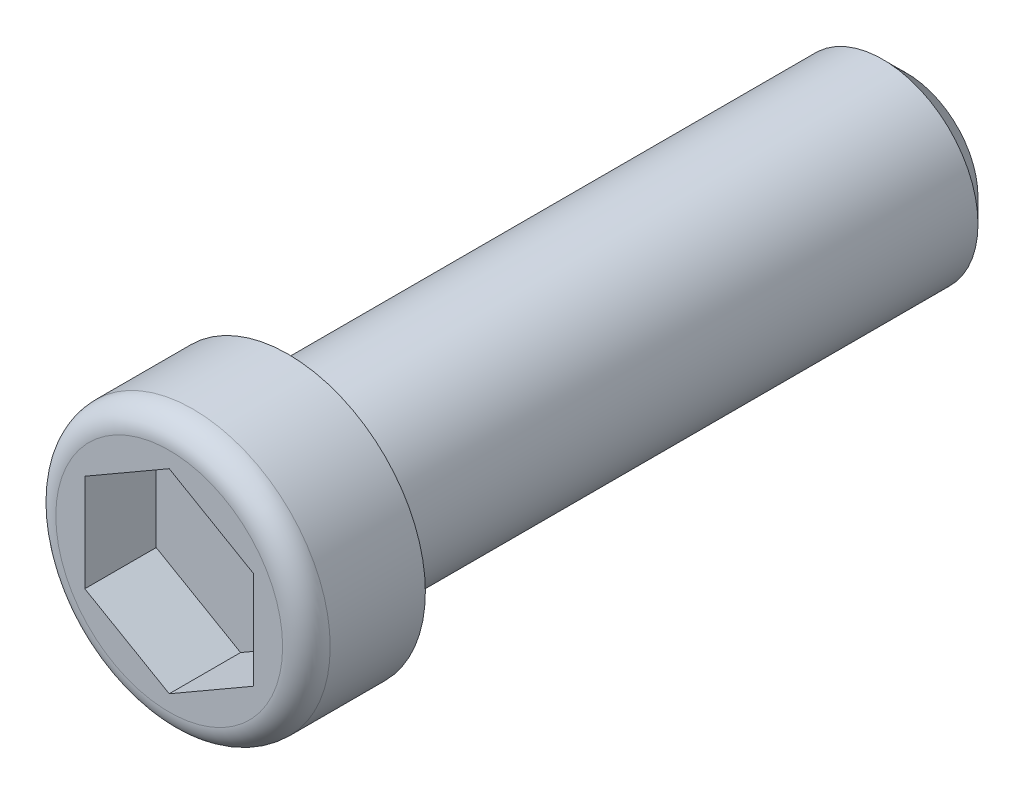
ISO-10303-21;
HEADER;
FILE_DESCRIPTION(('STEP AP214'),'2;1');
FILE_NAME('part.step','',(''),(''),'','','');
FILE_SCHEMA(('AUTOMOTIVE_DESIGN { 1 0 10303 214 1 1 1 1 }'));
ENDSEC;
DATA;
#1=APPLICATION_CONTEXT('core data for automotive mechanical design processes');
#2=APPLICATION_PROTOCOL_DEFINITION('international standard','automotive_design',2000,#1);
#3=PRODUCT_CONTEXT('',#1,'mechanical');
#4=PRODUCT('Part','Part','',(#3));
#5=PRODUCT_RELATED_PRODUCT_CATEGORY('part','',(#4));
#6=PRODUCT_DEFINITION_FORMATION('','',#4);
#7=PRODUCT_DEFINITION_CONTEXT('part definition',#1,'design');
#8=PRODUCT_DEFINITION('design','',#6,#7);
#9=PRODUCT_DEFINITION_SHAPE('','',#8);
#10=(LENGTH_UNIT() NAMED_UNIT(*) SI_UNIT(.MILLI.,.METRE.));
#11=(NAMED_UNIT(*) PLANE_ANGLE_UNIT() SI_UNIT($,.RADIAN.));
#12=(NAMED_UNIT(*) SI_UNIT($,.STERADIAN.) SOLID_ANGLE_UNIT());
#13=UNCERTAINTY_MEASURE_WITH_UNIT(LENGTH_MEASURE(1.E-05),#10,'distance_accuracy_value','');
#14=(GEOMETRIC_REPRESENTATION_CONTEXT(3) GLOBAL_UNCERTAINTY_ASSIGNED_CONTEXT((#13)) GLOBAL_UNIT_ASSIGNED_CONTEXT((#10,
#11,#12)) REPRESENTATION_CONTEXT('',''));
#15=CARTESIAN_POINT('',(0.,0.,0.));
#16=DIRECTION('',(0.,0.,1.));
#17=DIRECTION('',(1.,0.,0.));
#18=AXIS2_PLACEMENT_3D('',#15,#16,#17);
#19=CARTESIAN_POINT('',(0.,0.,13.));
#20=DIRECTION('',(0.,0.,-1.));
#21=DIRECTION('',(-1.,0.,0.));
#22=AXIS2_PLACEMENT_3D('',#19,#20,#21);
#23=CYLINDRICAL_SURFACE('',#22,2.);
#24=CARTESIAN_POINT('',(0.,0.,0.500000000000011));
#25=DIRECTION('',(0.,0.,1.));
#26=DIRECTION('',(1.,0.,0.));
#27=AXIS2_PLACEMENT_3D('',#24,#25,#26);
#28=CIRCLE('',#27,2.);
#29=CARTESIAN_POINT('',(-2.,0.,0.500000000000011));
#30=VERTEX_POINT('',#29);
#31=EDGE_CURVE('E150',#30,#30,#28,.T.);
#32=CARTESIAN_POINT('',(0.,0.,13.));
#33=DIRECTION('',(0.,0.,1.));
#34=DIRECTION('',(1.,0.,0.));
#35=AXIS2_PLACEMENT_3D('',#32,#33,#34);
#36=CIRCLE('',#35,2.);
#37=CARTESIAN_POINT('',(-2.,0.,13.));
#38=VERTEX_POINT('',#37);
#39=EDGE_CURVE('E147',#38,#38,#36,.T.);
#40=CARTESIAN_POINT('',(-2.,0.,0.500000000000011));
#41=CARTESIAN_POINT('',(-2.,0.,0.630208333333344));
#42=CARTESIAN_POINT('',(-2.,0.,0.760416666666678));
#43=CARTESIAN_POINT('',(-2.,0.,1.02083333333334));
#44=CARTESIAN_POINT('',(-2.,0.,1.15104166666668));
#45=CARTESIAN_POINT('',(-2.,0.,1.41145833333334));
#46=CARTESIAN_POINT('',(-2.,0.,1.54166666666668));
#47=CARTESIAN_POINT('',(-2.,0.,1.80208333333334));
#48=CARTESIAN_POINT('',(-2.,0.,1.93229166666668));
#49=CARTESIAN_POINT('',(-2.,0.,2.19270833333334));
#50=CARTESIAN_POINT('',(-2.,0.,2.32291666666668));
#51=CARTESIAN_POINT('',(-2.,0.,2.58333333333334));
#52=CARTESIAN_POINT('',(-2.,0.,2.71354166666668));
#53=CARTESIAN_POINT('',(-2.,0.,2.97395833333334));
#54=CARTESIAN_POINT('',(-2.,0.,3.10416666666668));
#55=CARTESIAN_POINT('',(-2.,0.,3.36458333333334));
#56=CARTESIAN_POINT('',(-2.,0.,3.49479166666667));
#57=CARTESIAN_POINT('',(-2.,0.,3.75520833333334));
#58=CARTESIAN_POINT('',(-2.,0.,3.88541666666667));
#59=CARTESIAN_POINT('',(-2.,0.,4.14583333333334));
#60=CARTESIAN_POINT('',(-2.,0.,4.27604166666667));
#61=CARTESIAN_POINT('',(-2.,0.,4.53645833333334));
#62=CARTESIAN_POINT('',(-2.,0.,4.66666666666667));
#63=CARTESIAN_POINT('',(-2.,0.,4.92708333333334));
#64=CARTESIAN_POINT('',(-2.,0.,5.05729166666667));
#65=CARTESIAN_POINT('',(-2.,0.,5.31770833333334));
#66=CARTESIAN_POINT('',(-2.,0.,5.44791666666667));
#67=CARTESIAN_POINT('',(-2.,0.,5.70833333333334));
#68=CARTESIAN_POINT('',(-2.,0.,5.83854166666667));
#69=CARTESIAN_POINT('',(-2.,0.,6.09895833333334));
#70=CARTESIAN_POINT('',(-2.,0.,6.22916666666667));
#71=CARTESIAN_POINT('',(-2.,0.,6.48958333333334));
#72=CARTESIAN_POINT('',(-2.,0.,6.61979166666667));
#73=CARTESIAN_POINT('',(-2.,0.,6.88020833333334));
#74=CARTESIAN_POINT('',(-2.,0.,7.01041666666667));
#75=CARTESIAN_POINT('',(-2.,0.,7.27083333333334));
#76=CARTESIAN_POINT('',(-2.,0.,7.40104166666667));
#77=CARTESIAN_POINT('',(-2.,0.,7.66145833333334));
#78=CARTESIAN_POINT('',(-2.,0.,7.79166666666667));
#79=CARTESIAN_POINT('',(-2.,0.,8.05208333333334));
#80=CARTESIAN_POINT('',(-2.,0.,8.18229166666667));
#81=CARTESIAN_POINT('',(-2.,0.,8.44270833333334));
#82=CARTESIAN_POINT('',(-2.,0.,8.57291666666667));
#83=CARTESIAN_POINT('',(-2.,0.,8.83333333333334));
#84=CARTESIAN_POINT('',(-2.,0.,8.96354166666667));
#85=CARTESIAN_POINT('',(-2.,0.,9.22395833333333));
#86=CARTESIAN_POINT('',(-2.,0.,9.35416666666667));
#87=CARTESIAN_POINT('',(-2.,0.,9.61458333333333));
#88=CARTESIAN_POINT('',(-2.,0.,9.74479166666667));
#89=CARTESIAN_POINT('',(-2.,0.,10.0052083333333));
#90=CARTESIAN_POINT('',(-2.,0.,10.1354166666667));
#91=CARTESIAN_POINT('',(-2.,0.,10.3958333333333));
#92=CARTESIAN_POINT('',(-2.,0.,10.5260416666667));
#93=CARTESIAN_POINT('',(-2.,0.,10.7864583333333));
#94=CARTESIAN_POINT('',(-2.,0.,10.9166666666667));
#95=CARTESIAN_POINT('',(-2.,0.,11.1770833333333));
#96=CARTESIAN_POINT('',(-2.,0.,11.3072916666667));
#97=CARTESIAN_POINT('',(-2.,0.,11.5677083333333));
#98=CARTESIAN_POINT('',(-2.,0.,11.6979166666667));
#99=CARTESIAN_POINT('',(-2.,0.,11.9583333333333));
#100=CARTESIAN_POINT('',(-2.,0.,12.0885416666667));
#101=CARTESIAN_POINT('',(-2.,0.,12.3489583333333));
#102=CARTESIAN_POINT('',(-2.,0.,12.4791666666667));
#103=CARTESIAN_POINT('',(-2.,0.,12.7395833333333));
#104=CARTESIAN_POINT('',(-2.,0.,12.8697916666667));
#105=CARTESIAN_POINT('',(-2.,0.,13.));
#106=B_SPLINE_CURVE_WITH_KNOTS('',3,(#40,#41,#42,#43,#44,#45,#46,#47,#48,#49,#50,#51,#52,#53,
#54,#55,#56,#57,#58,#59,#60,#61,#62,#63,#64,#65,#66,#67,#68,#69,#70,#71,#72,#73,#74,#75,#76,#77,
#78,#79,#80,#81,#82,#83,#84,#85,#86,#87,#88,#89,#90,#91,#92,#93,#94,#95,#96,#97,#98,#99,#100,
#101,#102,#103,#104,#105),.UNSPECIFIED.,.F.,.F.,(4,2,2,2,2,2,2,2,2,2,2,2,2,2,2,2,2,2,2,2,2,2,2,
2,2,2,2,2,2,2,2,2,4),(0.,0.390625,0.781249999999999,1.171875,1.5625,1.953125,2.34375,2.734375,
3.125,3.515625,3.90625,4.296875,4.68749999999999,5.07812499999999,5.46874999999999,
5.85937499999999,6.24999999999999,6.64062499999999,7.03124999999999,7.42187499999999,
7.81249999999999,8.20312499999999,8.59374999999999,8.98437499999999,9.37499999999999,
9.76562499999999,10.15625,10.546875,10.9375,11.328125,11.71875,12.109375,12.5),.UNSPECIFIED.);
#107=EDGE_CURVE('BSEAM37',#30,#38,#106,.T.);
#108=ORIENTED_EDGE('',*,*,#31,.T.);
#109=ORIENTED_EDGE('',*,*,#39,.F.);
#110=ORIENTED_EDGE('',*,*,#107,.T.);
#111=ORIENTED_EDGE('',*,*,#107,.F.);
#112=EDGE_LOOP('',(#108,#110,#109,#111));
#113=FACE_BOUND('',#112,.T.);
#114=ADVANCED_FACE('F37',(#113),#23,.T.);
#115=CARTESIAN_POINT('',(0.,0.,0.));
#116=DIRECTION('',(0.,0.,1.));
#117=DIRECTION('',(1.,0.,0.));
#118=AXIS2_PLACEMENT_3D('',#115,#116,#117);
#119=PLANE('',#118);
#120=CARTESIAN_POINT('',(0.,0.,0.));
#121=DIRECTION('',(0.,0.,1.));
#122=DIRECTION('',(1.,0.,0.));
#123=AXIS2_PLACEMENT_3D('',#120,#121,#122);
#124=CIRCLE('',#123,1.49999999999999);
#125=CARTESIAN_POINT('',(1.49999999999999,0.,0.));
#126=VERTEX_POINT('',#125);
#127=EDGE_CURVE('E153',#126,#126,#124,.F.);
#128=ORIENTED_EDGE('',*,*,#127,.T.);
#129=EDGE_LOOP('',(#128));
#130=FACE_BOUND('',#129,.T.);
#131=ADVANCED_FACE('F170',(#130),#119,.F.);
#132=CARTESIAN_POINT('',(0.,0.,15.5));
#133=DIRECTION('',(0.,0.,-1.));
#134=DIRECTION('',(-1.,0.,0.));
#135=AXIS2_PLACEMENT_3D('',#132,#133,#134);
#136=CYLINDRICAL_SURFACE('',#135,2.88382227084636);
#137=CARTESIAN_POINT('',(0.,0.,15.));
#138=DIRECTION('',(0.,0.,1.));
#139=DIRECTION('',(1.,0.,0.));
#140=AXIS2_PLACEMENT_3D('',#137,#138,#139);
#141=CIRCLE('',#140,2.88382227084636);
#142=CARTESIAN_POINT('',(2.88382227084636,0.,15.));
#143=VERTEX_POINT('',#142);
#144=EDGE_CURVE('E11',#143,#143,#141,.F.);
#145=ORIENTED_EDGE('',*,*,#144,.T.);
#146=EDGE_LOOP('',(#145));
#147=FACE_BOUND('',#146,.T.);
#148=CARTESIAN_POINT('',(0.,0.,13.));
#149=DIRECTION('',(0.,0.,1.));
#150=DIRECTION('',(1.,0.,0.));
#151=AXIS2_PLACEMENT_3D('',#148,#149,#150);
#152=CIRCLE('',#151,2.88382227084636);
#153=CARTESIAN_POINT('',(2.88382227084636,0.,13.));
#154=VERTEX_POINT('',#153);
#155=EDGE_CURVE('E139',#154,#154,#152,.T.);
#156=ORIENTED_EDGE('',*,*,#155,.T.);
#157=EDGE_LOOP('',(#156));
#158=FACE_BOUND('',#157,.T.);
#159=ADVANCED_FACE('F176',(#147,#158),#136,.T.);
#160=CARTESIAN_POINT('',(0.,0.,15.5));
#161=DIRECTION('',(0.,0.,1.));
#162=DIRECTION('',(1.,0.,0.));
#163=AXIS2_PLACEMENT_3D('',#160,#161,#162);
#164=PLANE('',#163);
#165=CARTESIAN_POINT('',(0.,0.,15.5));
#166=DIRECTION('',(0.,0.,1.));
#167=DIRECTION('',(1.,0.,0.));
#168=AXIS2_PLACEMENT_3D('',#165,#166,#167);
#169=CIRCLE('',#168,2.38382227084636);
#170=CARTESIAN_POINT('',(2.38382227084636,0.,15.5));
#171=VERTEX_POINT('',#170);
#172=EDGE_CURVE('E45',#171,#171,#169,.T.);
#173=ORIENTED_EDGE('',*,*,#172,.T.);
#174=EDGE_LOOP('',(#173));
#175=FACE_BOUND('',#174,.T.);
#176=DIRECTION('',(-0.866025403784442,0.499999999999995,0.));
#177=VECTOR('',#176,1.);
#178=CARTESIAN_POINT('',(1.77399525281968,1.02421663675659,15.5));
#179=LINE('',#178,#177);
#180=CARTESIAN_POINT('',(1.77399525281968,1.02421663675659,15.5));
#181=VERTEX_POINT('',#180);
#182=CARTESIAN_POINT('',(0.,2.04843327351313,15.5));
#183=VERTEX_POINT('',#182);
#184=EDGE_CURVE('E52',#181,#183,#179,.T.);
#185=ORIENTED_EDGE('',*,*,#184,.F.);
#186=DIRECTION('',(0.,1.,0.));
#187=VECTOR('',#186,1.);
#188=CARTESIAN_POINT('',(1.7739952528197,-1.02421663675655,15.5));
#189=LINE('',#188,#187);
#190=CARTESIAN_POINT('',(1.7739952528197,-1.02421663675655,15.5));
#191=VERTEX_POINT('',#190);
#192=EDGE_CURVE('E135',#191,#181,#189,.T.);
#193=ORIENTED_EDGE('',*,*,#192,.F.);
#194=DIRECTION('',(0.866025403784435,0.500000000000007,0.));
#195=VECTOR('',#194,1.);
#196=CARTESIAN_POINT('',(0.,-2.04843327351313,15.5));
#197=LINE('',#196,#195);
#198=CARTESIAN_POINT('',(0.,-2.04843327351313,15.5));
#199=VERTEX_POINT('',#198);
#200=EDGE_CURVE('E133',#199,#191,#197,.T.);
#201=ORIENTED_EDGE('',*,*,#200,.F.);
#202=DIRECTION('',(0.866025403784442,-0.499999999999995,0.));
#203=VECTOR('',#202,1.);
#204=CARTESIAN_POINT('',(-1.77399525281968,-1.02421663675657,15.5));
#205=LINE('',#204,#203);
#206=CARTESIAN_POINT('',(-1.77399525281968,-1.02421663675657,15.5));
#207=VERTEX_POINT('',#206);
#208=EDGE_CURVE('E100',#207,#199,#205,.T.);
#209=ORIENTED_EDGE('',*,*,#208,.F.);
#210=DIRECTION('',(0.,-1.,0.));
#211=VECTOR('',#210,1.);
#212=CARTESIAN_POINT('',(-1.77399525281969,1.02421663675656,15.5));
#213=LINE('',#212,#211);
#214=CARTESIAN_POINT('',(-1.77399525281969,1.02421663675656,15.5));
#215=VERTEX_POINT('',#214);
#216=EDGE_CURVE('E129',#215,#207,#213,.T.);
#217=ORIENTED_EDGE('',*,*,#216,.F.);
#218=DIRECTION('',(-0.866025403784438,-0.500000000000001,0.));
#219=VECTOR('',#218,1.);
#220=CARTESIAN_POINT('',(0.,2.04843327351313,15.5));
#221=LINE('',#220,#219);
#222=EDGE_CURVE('E126',#183,#215,#221,.T.);
#223=ORIENTED_EDGE('',*,*,#222,.F.);
#224=EDGE_LOOP('',(#185,#193,#201,#209,#217,#223));
#225=FACE_BOUND('',#224,.T.);
#226=ADVANCED_FACE('F158',(#175,#225),#164,.T.);
#227=CARTESIAN_POINT('',(0.,0.,13.));
#228=DIRECTION('',(0.,0.,1.));
#229=DIRECTION('',(1.,0.,0.));
#230=AXIS2_PLACEMENT_3D('',#227,#228,#229);
#231=PLANE('',#230);
#232=ORIENTED_EDGE('',*,*,#39,.T.);
#233=EDGE_LOOP('',(#232));
#234=FACE_BOUND('',#233,.T.);
#235=ORIENTED_EDGE('',*,*,#155,.F.);
#236=EDGE_LOOP('',(#235));
#237=FACE_BOUND('',#236,.T.);
#238=ADVANCED_FACE('F184',(#234,#237),#231,.F.);
#239=CARTESIAN_POINT('',(1.77399525281968,1.02421663675659,14.));
#240=DIRECTION('',(0.499999999999995,0.866025403784441,0.));
#241=DIRECTION('',(-0.866025403784442,0.499999999999995,0.));
#242=AXIS2_PLACEMENT_3D('',#239,#240,#241);
#243=PLANE('',#242);
#244=ORIENTED_EDGE('',*,*,#184,.T.);
#245=DIRECTION('',(0.,0.,1.));
#246=VECTOR('',#245,1.);
#247=CARTESIAN_POINT('',(0.,2.04843327351313,14.));
#248=LINE('',#247,#246);
#249=CARTESIAN_POINT('',(0.,2.04843327351313,14.));
#250=VERTEX_POINT('',#249);
#251=EDGE_CURVE('E82',#250,#183,#248,.T.);
#252=ORIENTED_EDGE('',*,*,#251,.F.);
#253=DIRECTION('',(-0.866025403784442,0.499999999999995,0.));
#254=VECTOR('',#253,1.);
#255=CARTESIAN_POINT('',(1.77399525281968,1.02421663675659,14.));
#256=LINE('',#255,#254);
#257=CARTESIAN_POINT('',(1.77399525281968,1.02421663675659,14.));
#258=VERTEX_POINT('',#257);
#259=EDGE_CURVE('E137',#258,#250,#256,.T.);
#260=ORIENTED_EDGE('',*,*,#259,.F.);
#261=DIRECTION('',(0.,0.,1.));
#262=VECTOR('',#261,1.);
#263=CARTESIAN_POINT('',(1.77399525281968,1.02421663675659,14.));
#264=LINE('',#263,#262);
#265=EDGE_CURVE('E60',#258,#181,#264,.T.);
#266=ORIENTED_EDGE('',*,*,#265,.T.);
#267=EDGE_LOOP('',(#244,#252,#260,#266));
#268=FACE_BOUND('',#267,.T.);
#269=ADVANCED_FACE('F187',(#268),#243,.F.);
#270=CARTESIAN_POINT('',(1.7739952528197,-1.02421663675655,14.));
#271=DIRECTION('',(1.,0.,0.));
#272=DIRECTION('',(0.,1.,0.));
#273=AXIS2_PLACEMENT_3D('',#270,#271,#272);
#274=PLANE('',#273);
#275=ORIENTED_EDGE('',*,*,#192,.T.);
#276=ORIENTED_EDGE('',*,*,#265,.F.);
#277=DIRECTION('',(0.,1.,0.));
#278=VECTOR('',#277,1.);
#279=CARTESIAN_POINT('',(1.7739952528197,-1.02421663675655,14.));
#280=LINE('',#279,#278);
#281=CARTESIAN_POINT('',(1.7739952528197,-1.02421663675655,14.));
#282=VERTEX_POINT('',#281);
#283=EDGE_CURVE('E112',#282,#258,#280,.T.);
#284=ORIENTED_EDGE('',*,*,#283,.F.);
#285=DIRECTION('',(0.,0.,1.));
#286=VECTOR('',#285,1.);
#287=CARTESIAN_POINT('',(1.7739952528197,-1.02421663675655,14.));
#288=LINE('',#287,#286);
#289=EDGE_CURVE('E104',#282,#191,#288,.T.);
#290=ORIENTED_EDGE('',*,*,#289,.T.);
#291=EDGE_LOOP('',(#275,#276,#284,#290));
#292=FACE_BOUND('',#291,.T.);
#293=ADVANCED_FACE('F193',(#292),#274,.F.);
#294=CARTESIAN_POINT('',(0.,-2.04843327351313,14.));
#295=DIRECTION('',(0.500000000000007,-0.866025403784434,0.));
#296=DIRECTION('',(0.866025403784435,0.500000000000007,0.));
#297=AXIS2_PLACEMENT_3D('',#294,#295,#296);
#298=PLANE('',#297);
#299=ORIENTED_EDGE('',*,*,#200,.T.);
#300=ORIENTED_EDGE('',*,*,#289,.F.);
#301=DIRECTION('',(0.866025403784435,0.500000000000007,0.));
#302=VECTOR('',#301,1.);
#303=CARTESIAN_POINT('',(0.,-2.04843327351313,14.));
#304=LINE('',#303,#302);
#305=CARTESIAN_POINT('',(0.,-2.04843327351313,14.));
#306=VERTEX_POINT('',#305);
#307=EDGE_CURVE('E108',#306,#282,#304,.T.);
#308=ORIENTED_EDGE('',*,*,#307,.F.);
#309=DIRECTION('',(0.,0.,1.));
#310=VECTOR('',#309,1.);
#311=CARTESIAN_POINT('',(0.,-2.04843327351313,14.));
#312=LINE('',#311,#310);
#313=EDGE_CURVE('E93',#306,#199,#312,.T.);
#314=ORIENTED_EDGE('',*,*,#313,.T.);
#315=EDGE_LOOP('',(#299,#300,#308,#314));
#316=FACE_BOUND('',#315,.T.);
#317=ADVANCED_FACE('F109',(#316),#298,.F.);
#318=CARTESIAN_POINT('',(-1.77399525281968,-1.02421663675657,14.));
#319=DIRECTION('',(-0.499999999999995,-0.866025403784441,0.));
#320=DIRECTION('',(0.866025403784442,-0.499999999999995,0.));
#321=AXIS2_PLACEMENT_3D('',#318,#319,#320);
#322=PLANE('',#321);
#323=ORIENTED_EDGE('',*,*,#208,.T.);
#324=ORIENTED_EDGE('',*,*,#313,.F.);
#325=DIRECTION('',(0.866025403784442,-0.499999999999995,0.));
#326=VECTOR('',#325,1.);
#327=CARTESIAN_POINT('',(-1.77399525281968,-1.02421663675657,14.));
#328=LINE('',#327,#326);
#329=CARTESIAN_POINT('',(-1.77399525281968,-1.02421663675657,14.));
#330=VERTEX_POINT('',#329);
#331=EDGE_CURVE('E97',#330,#306,#328,.T.);
#332=ORIENTED_EDGE('',*,*,#331,.F.);
#333=DIRECTION('',(0.,0.,1.));
#334=VECTOR('',#333,1.);
#335=CARTESIAN_POINT('',(-1.77399525281968,-1.02421663675657,14.));
#336=LINE('',#335,#334);
#337=EDGE_CURVE('E105',#330,#207,#336,.T.);
#338=ORIENTED_EDGE('',*,*,#337,.T.);
#339=EDGE_LOOP('',(#323,#324,#332,#338));
#340=FACE_BOUND('',#339,.T.);
#341=ADVANCED_FACE('F95',(#340),#322,.F.);
#342=CARTESIAN_POINT('',(-1.77399525281969,1.02421663675656,14.));
#343=DIRECTION('',(-1.,0.,0.));
#344=DIRECTION('',(0.,-1.,0.));
#345=AXIS2_PLACEMENT_3D('',#342,#343,#344);
#346=PLANE('',#345);
#347=ORIENTED_EDGE('',*,*,#216,.T.);
#348=ORIENTED_EDGE('',*,*,#337,.F.);
#349=DIRECTION('',(0.,-1.,0.));
#350=VECTOR('',#349,1.);
#351=CARTESIAN_POINT('',(-1.77399525281969,1.02421663675656,14.));
#352=LINE('',#351,#350);
#353=CARTESIAN_POINT('',(-1.77399525281969,1.02421663675656,14.));
#354=VERTEX_POINT('',#353);
#355=EDGE_CURVE('E118',#354,#330,#352,.T.);
#356=ORIENTED_EDGE('',*,*,#355,.F.);
#357=DIRECTION('',(0.,0.,1.));
#358=VECTOR('',#357,1.);
#359=CARTESIAN_POINT('',(-1.77399525281969,1.02421663675656,14.));
#360=LINE('',#359,#358);
#361=EDGE_CURVE('E142',#354,#215,#360,.T.);
#362=ORIENTED_EDGE('',*,*,#361,.T.);
#363=EDGE_LOOP('',(#347,#348,#356,#362));
#364=FACE_BOUND('',#363,.T.);
#365=ADVANCED_FACE('F197',(#364),#346,.F.);
#366=CARTESIAN_POINT('',(0.,2.04843327351313,14.));
#367=DIRECTION('',(-0.500000000000001,0.866025403784438,0.));
#368=DIRECTION('',(-0.866025403784438,-0.500000000000001,0.));
#369=AXIS2_PLACEMENT_3D('',#366,#367,#368);
#370=PLANE('',#369);
#371=ORIENTED_EDGE('',*,*,#222,.T.);
#372=ORIENTED_EDGE('',*,*,#361,.F.);
#373=DIRECTION('',(-0.866025403784438,-0.500000000000001,0.));
#374=VECTOR('',#373,1.);
#375=CARTESIAN_POINT('',(0.,2.04843327351313,14.));
#376=LINE('',#375,#374);
#377=EDGE_CURVE('E120',#250,#354,#376,.T.);
#378=ORIENTED_EDGE('',*,*,#377,.F.);
#379=ORIENTED_EDGE('',*,*,#251,.T.);
#380=EDGE_LOOP('',(#371,#372,#378,#379));
#381=FACE_BOUND('',#380,.T.);
#382=ADVANCED_FACE('F194',(#381),#370,.F.);
#383=CARTESIAN_POINT('',(0.,0.,14.));
#384=DIRECTION('',(0.,0.,1.));
#385=DIRECTION('',(1.,0.,0.));
#386=AXIS2_PLACEMENT_3D('',#383,#384,#385);
#387=PLANE('',#386);
#388=ORIENTED_EDGE('',*,*,#259,.T.);
#389=ORIENTED_EDGE('',*,*,#377,.T.);
#390=ORIENTED_EDGE('',*,*,#355,.T.);
#391=ORIENTED_EDGE('',*,*,#331,.T.);
#392=ORIENTED_EDGE('',*,*,#307,.T.);
#393=ORIENTED_EDGE('',*,*,#283,.T.);
#394=EDGE_LOOP('',(#388,#389,#390,#391,#392,#393));
#395=FACE_BOUND('',#394,.T.);
#396=ADVANCED_FACE('F115',(#395),#387,.T.);
#397=CARTESIAN_POINT('',(0.,0.,0.500000000000011));
#398=DIRECTION('',(0.,0.,1.));
#399=DIRECTION('',(1.,0.,0.));
#400=AXIS2_PLACEMENT_3D('',#397,#398,#399);
#401=CONICAL_SURFACE('',#400,2.,0.78539816339745);
#402=ORIENTED_EDGE('',*,*,#127,.F.);
#403=EDGE_LOOP('',(#402));
#404=FACE_BOUND('',#403,.T.);
#405=ORIENTED_EDGE('',*,*,#31,.F.);
#406=EDGE_LOOP('',(#405));
#407=FACE_BOUND('',#406,.T.);
#408=ADVANCED_FACE('F162',(#404,#407),#401,.T.);
#409=CARTESIAN_POINT('',(0.,0.,15.));
#410=DIRECTION('',(0.,0.,1.));
#411=DIRECTION('',(1.,0.,0.));
#412=AXIS2_PLACEMENT_3D('',#409,#410,#411);
#413=TOROIDAL_SURFACE('',#412,2.38382227084636,0.5);
#414=ORIENTED_EDGE('',*,*,#144,.F.);
#415=EDGE_LOOP('',(#414));
#416=FACE_BOUND('',#415,.T.);
#417=ORIENTED_EDGE('',*,*,#172,.F.);
#418=EDGE_LOOP('',(#417));
#419=FACE_BOUND('',#418,.T.);
#420=ADVANCED_FACE('F39',(#416,#419),#413,.T.);
#421=CLOSED_SHELL('',(#114,#131,#159,#226,#238,#269,#293,#317,#341,#365,#382,#396,#408,#420));
#422=MANIFOLD_SOLID_BREP('B2',#421);
#423=ADVANCED_BREP_SHAPE_REPRESENTATION('',(#18,#422),#14);
#424=SHAPE_DEFINITION_REPRESENTATION(#9,#423);
ENDSEC;
END-ISO-10303-21;
